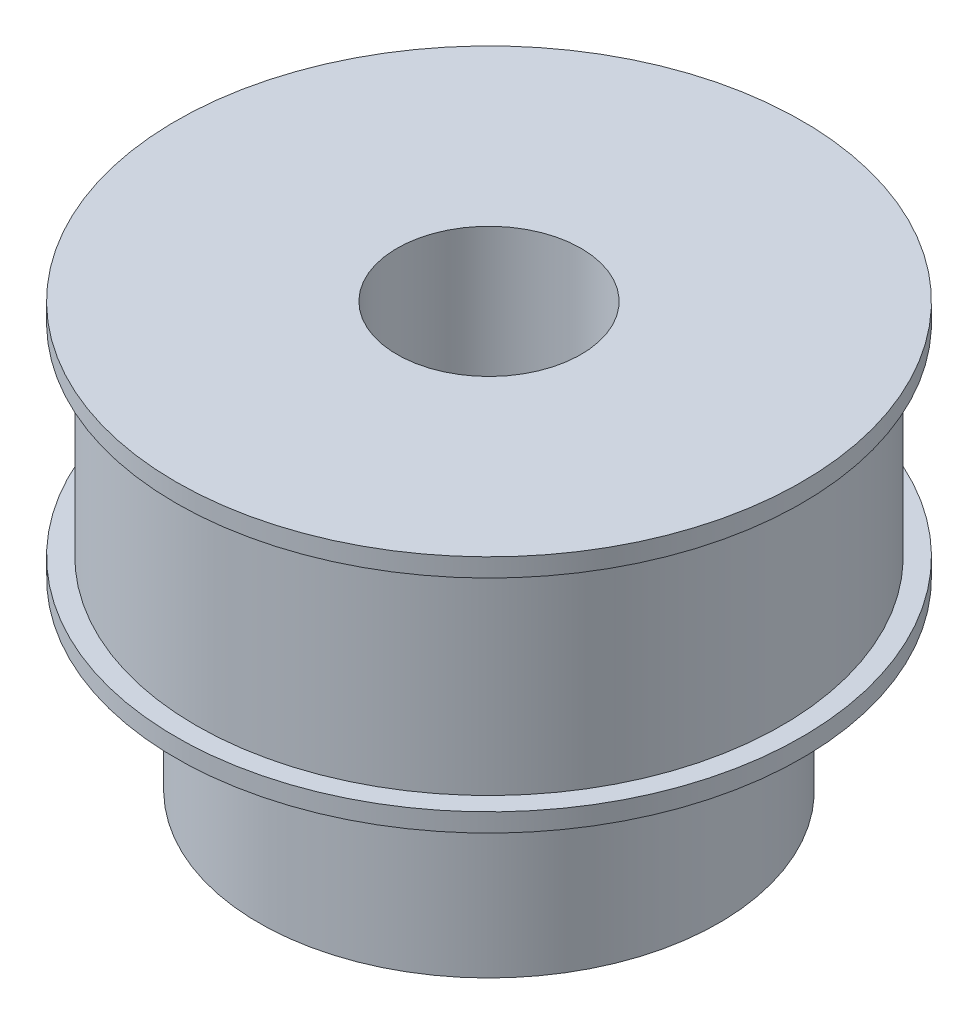
ISO-10303-21;
HEADER;
FILE_DESCRIPTION(('STEP AP214'),'2;1');
FILE_NAME('part.step','',(''),(''),'','','');
FILE_SCHEMA(('AUTOMOTIVE_DESIGN { 1 0 10303 214 1 1 1 1 }'));
ENDSEC;
DATA;
#1=APPLICATION_CONTEXT('core data for automotive mechanical design processes');
#2=APPLICATION_PROTOCOL_DEFINITION('international standard','automotive_design',2000,#1);
#3=PRODUCT_CONTEXT('',#1,'mechanical');
#4=PRODUCT('Part','Part','',(#3));
#5=PRODUCT_RELATED_PRODUCT_CATEGORY('part','',(#4));
#6=PRODUCT_DEFINITION_FORMATION('','',#4);
#7=PRODUCT_DEFINITION_CONTEXT('part definition',#1,'design');
#8=PRODUCT_DEFINITION('design','',#6,#7);
#9=PRODUCT_DEFINITION_SHAPE('','',#8);
#10=(LENGTH_UNIT() NAMED_UNIT(*) SI_UNIT(.MILLI.,.METRE.));
#11=(NAMED_UNIT(*) PLANE_ANGLE_UNIT() SI_UNIT($,.RADIAN.));
#12=(NAMED_UNIT(*) SI_UNIT($,.STERADIAN.) SOLID_ANGLE_UNIT());
#13=UNCERTAINTY_MEASURE_WITH_UNIT(LENGTH_MEASURE(1.E-05),#10,'distance_accuracy_value','');
#14=(GEOMETRIC_REPRESENTATION_CONTEXT(3) GLOBAL_UNCERTAINTY_ASSIGNED_CONTEXT((#13)) GLOBAL_UNIT_ASSIGNED_CONTEXT((#10,
#11,#12)) REPRESENTATION_CONTEXT('',''));
#15=CARTESIAN_POINT('',(0.,0.,0.));
#16=DIRECTION('',(0.,0.,1.));
#17=DIRECTION('',(1.,0.,0.));
#18=AXIS2_PLACEMENT_3D('',#15,#16,#17);
#19=CARTESIAN_POINT('',(0.,11.,0.));
#20=DIRECTION('',(0.,-1.,0.));
#21=DIRECTION('',(0.,0.,-1.));
#22=AXIS2_PLACEMENT_3D('',#19,#20,#21);
#23=CYLINDRICAL_SURFACE('',#22,15.915);
#24=CARTESIAN_POINT('',(0.,11.,0.));
#25=DIRECTION('',(0.,1.,0.));
#26=DIRECTION('',(0.,0.,1.));
#27=AXIS2_PLACEMENT_3D('',#24,#25,#26);
#28=CIRCLE('',#27,15.915);
#29=CARTESIAN_POINT('',(0.,11.,15.915));
#30=VERTEX_POINT('',#29);
#31=EDGE_CURVE('E39',#30,#30,#28,.T.);
#32=ORIENTED_EDGE('',*,*,#31,.F.);
#33=EDGE_LOOP('',(#32));
#34=FACE_BOUND('',#33,.T.);
#35=CARTESIAN_POINT('',(0.,0.,0.));
#36=DIRECTION('',(0.,1.,0.));
#37=DIRECTION('',(0.,0.,1.));
#38=AXIS2_PLACEMENT_3D('',#35,#36,#37);
#39=CIRCLE('',#38,15.915);
#40=CARTESIAN_POINT('',(0.,0.,15.915));
#41=VERTEX_POINT('',#40);
#42=EDGE_CURVE('E35',#41,#41,#39,.T.);
#43=ORIENTED_EDGE('',*,*,#42,.T.);
#44=EDGE_LOOP('',(#43));
#45=FACE_BOUND('',#44,.T.);
#46=ADVANCED_FACE('F32',(#34,#45),#23,.T.);
#47=CARTESIAN_POINT('',(0.,12.,0.));
#48=DIRECTION('',(0.,-1.,0.));
#49=DIRECTION('',(0.,0.,-1.));
#50=AXIS2_PLACEMENT_3D('',#47,#48,#49);
#51=CYLINDRICAL_SURFACE('',#50,17.);
#52=CARTESIAN_POINT('',(0.,12.,0.));
#53=DIRECTION('',(0.,1.,0.));
#54=DIRECTION('',(0.,0.,1.));
#55=AXIS2_PLACEMENT_3D('',#52,#53,#54);
#56=CIRCLE('',#55,17.);
#57=CARTESIAN_POINT('',(0.,12.,17.));
#58=VERTEX_POINT('',#57);
#59=EDGE_CURVE('E44',#58,#58,#56,.T.);
#60=ORIENTED_EDGE('',*,*,#59,.F.);
#61=EDGE_LOOP('',(#60));
#62=FACE_BOUND('',#61,.T.);
#63=CARTESIAN_POINT('',(0.,11.,0.));
#64=DIRECTION('',(0.,1.,0.));
#65=DIRECTION('',(0.,0.,1.));
#66=AXIS2_PLACEMENT_3D('',#63,#64,#65);
#67=CIRCLE('',#66,17.);
#68=CARTESIAN_POINT('',(0.,11.,17.));
#69=VERTEX_POINT('',#68);
#70=EDGE_CURVE('E60',#69,#69,#67,.T.);
#71=ORIENTED_EDGE('',*,*,#70,.T.);
#72=EDGE_LOOP('',(#71));
#73=FACE_BOUND('',#72,.T.);
#74=ADVANCED_FACE('F93',(#62,#73),#51,.T.);
#75=CARTESIAN_POINT('',(0.,12.,0.));
#76=DIRECTION('',(0.,1.,0.));
#77=DIRECTION('',(0.,0.,1.));
#78=AXIS2_PLACEMENT_3D('',#75,#76,#77);
#79=PLANE('',#78);
#80=CARTESIAN_POINT('',(0.,12.,0.));
#81=DIRECTION('',(0.,-1.,0.));
#82=DIRECTION('',(0.,0.,-1.));
#83=AXIS2_PLACEMENT_3D('',#80,#81,#82);
#84=CIRCLE('',#83,5.);
#85=CARTESIAN_POINT('',(0.,12.,-5.));
#86=VERTEX_POINT('',#85);
#87=EDGE_CURVE('E49',#86,#86,#84,.T.);
#88=ORIENTED_EDGE('',*,*,#87,.T.);
#89=EDGE_LOOP('',(#88));
#90=FACE_BOUND('',#89,.T.);
#91=ORIENTED_EDGE('',*,*,#59,.T.);
#92=EDGE_LOOP('',(#91));
#93=FACE_BOUND('',#92,.T.);
#94=ADVANCED_FACE('F87',(#90,#93),#79,.T.);
#95=CARTESIAN_POINT('',(0.,11.,0.));
#96=DIRECTION('',(0.,1.,0.));
#97=DIRECTION('',(0.,0.,1.));
#98=AXIS2_PLACEMENT_3D('',#95,#96,#97);
#99=PLANE('',#98);
#100=ORIENTED_EDGE('',*,*,#31,.T.);
#101=EDGE_LOOP('',(#100));
#102=FACE_BOUND('',#101,.T.);
#103=ORIENTED_EDGE('',*,*,#70,.F.);
#104=EDGE_LOOP('',(#103));
#105=FACE_BOUND('',#104,.T.);
#106=ADVANCED_FACE('F78',(#102,#105),#99,.F.);
#107=CARTESIAN_POINT('',(0.,-1.,0.));
#108=DIRECTION('',(0.,1.,0.));
#109=DIRECTION('',(0.,0.,1.));
#110=AXIS2_PLACEMENT_3D('',#107,#108,#109);
#111=CYLINDRICAL_SURFACE('',#110,17.);
#112=CARTESIAN_POINT('',(0.,-1.,0.));
#113=DIRECTION('',(0.,-1.,0.));
#114=DIRECTION('',(0.,0.,-1.));
#115=AXIS2_PLACEMENT_3D('',#112,#113,#114);
#116=CIRCLE('',#115,17.);
#117=CARTESIAN_POINT('',(0.,-1.,-17.));
#118=VERTEX_POINT('',#117);
#119=EDGE_CURVE('E53',#118,#118,#116,.T.);
#120=ORIENTED_EDGE('',*,*,#119,.F.);
#121=EDGE_LOOP('',(#120));
#122=FACE_BOUND('',#121,.T.);
#123=CARTESIAN_POINT('',(0.,0.,0.));
#124=DIRECTION('',(0.,-1.,0.));
#125=DIRECTION('',(0.,0.,-1.));
#126=AXIS2_PLACEMENT_3D('',#123,#124,#125);
#127=CIRCLE('',#126,17.);
#128=CARTESIAN_POINT('',(0.,0.,-17.));
#129=VERTEX_POINT('',#128);
#130=EDGE_CURVE('E52',#129,#129,#127,.T.);
#131=ORIENTED_EDGE('',*,*,#130,.T.);
#132=EDGE_LOOP('',(#131));
#133=FACE_BOUND('',#132,.T.);
#134=ADVANCED_FACE('F76',(#122,#133),#111,.T.);
#135=CARTESIAN_POINT('',(0.,-1.,0.));
#136=DIRECTION('',(0.,-1.,0.));
#137=DIRECTION('',(0.,0.,-1.));
#138=AXIS2_PLACEMENT_3D('',#135,#136,#137);
#139=PLANE('',#138);
#140=CARTESIAN_POINT('',(0.,-1.,0.));
#141=DIRECTION('',(0.,-1.,0.));
#142=DIRECTION('',(0.,0.,-1.));
#143=AXIS2_PLACEMENT_3D('',#140,#141,#142);
#144=CIRCLE('',#143,12.5);
#145=CARTESIAN_POINT('',(0.,-1.,-12.5));
#146=VERTEX_POINT('',#145);
#147=EDGE_CURVE('E10',#146,#146,#144,.T.);
#148=ORIENTED_EDGE('',*,*,#147,.F.);
#149=EDGE_LOOP('',(#148));
#150=FACE_BOUND('',#149,.T.);
#151=ORIENTED_EDGE('',*,*,#119,.T.);
#152=EDGE_LOOP('',(#151));
#153=FACE_BOUND('',#152,.T.);
#154=ADVANCED_FACE('F72',(#150,#153),#139,.T.);
#155=CARTESIAN_POINT('',(0.,0.,0.));
#156=DIRECTION('',(0.,-1.,0.));
#157=DIRECTION('',(0.,0.,-1.));
#158=AXIS2_PLACEMENT_3D('',#155,#156,#157);
#159=PLANE('',#158);
#160=ORIENTED_EDGE('',*,*,#42,.F.);
#161=EDGE_LOOP('',(#160));
#162=FACE_BOUND('',#161,.T.);
#163=ORIENTED_EDGE('',*,*,#130,.F.);
#164=EDGE_LOOP('',(#163));
#165=FACE_BOUND('',#164,.T.);
#166=ADVANCED_FACE('F68',(#162,#165),#159,.F.);
#167=CARTESIAN_POINT('',(0.,12.,0.));
#168=DIRECTION('',(0.,-1.,0.));
#169=DIRECTION('',(0.,0.,-1.));
#170=AXIS2_PLACEMENT_3D('',#167,#168,#169);
#171=CYLINDRICAL_SURFACE('',#170,5.);
#172=ORIENTED_EDGE('',*,*,#87,.F.);
#173=EDGE_LOOP('',(#172));
#174=FACE_BOUND('',#173,.T.);
#175=CARTESIAN_POINT('',(0.,-11.,0.));
#176=DIRECTION('',(0.,-1.,0.));
#177=DIRECTION('',(0.,0.,-1.));
#178=AXIS2_PLACEMENT_3D('',#175,#176,#177);
#179=CIRCLE('',#178,5.);
#180=CARTESIAN_POINT('',(0.,-11.,-5.));
#181=VERTEX_POINT('',#180);
#182=EDGE_CURVE('E117',#181,#181,#179,.T.);
#183=ORIENTED_EDGE('',*,*,#182,.T.);
#184=EDGE_LOOP('',(#183));
#185=FACE_BOUND('',#184,.T.);
#186=ADVANCED_FACE('F71',(#174,#185),#171,.F.);
#187=CARTESIAN_POINT('',(0.,-11.,0.));
#188=DIRECTION('',(0.,-1.,0.));
#189=DIRECTION('',(0.,0.,-1.));
#190=AXIS2_PLACEMENT_3D('',#187,#188,#189);
#191=PLANE('',#190);
#192=CARTESIAN_POINT('',(0.,-11.,0.));
#193=DIRECTION('',(0.,-1.,0.));
#194=DIRECTION('',(0.,0.,-1.));
#195=AXIS2_PLACEMENT_3D('',#192,#193,#194);
#196=CIRCLE('',#195,12.5);
#197=CARTESIAN_POINT('',(0.,-11.,-12.5));
#198=VERTEX_POINT('',#197);
#199=EDGE_CURVE('E47',#198,#198,#196,.T.);
#200=ORIENTED_EDGE('',*,*,#199,.T.);
#201=EDGE_LOOP('',(#200));
#202=FACE_BOUND('',#201,.T.);
#203=ORIENTED_EDGE('',*,*,#182,.F.);
#204=EDGE_LOOP('',(#203));
#205=FACE_BOUND('',#204,.T.);
#206=ADVANCED_FACE('F113',(#202,#205),#191,.T.);
#207=CARTESIAN_POINT('',(0.,-11.,0.));
#208=DIRECTION('',(0.,1.,0.));
#209=DIRECTION('',(0.,0.,1.));
#210=AXIS2_PLACEMENT_3D('',#207,#208,#209);
#211=CYLINDRICAL_SURFACE('',#210,12.5);
#212=ORIENTED_EDGE('',*,*,#199,.F.);
#213=EDGE_LOOP('',(#212));
#214=FACE_BOUND('',#213,.T.);
#215=ORIENTED_EDGE('',*,*,#147,.T.);
#216=EDGE_LOOP('',(#215));
#217=FACE_BOUND('',#216,.T.);
#218=ADVANCED_FACE('F123',(#214,#217),#211,.T.);
#219=CLOSED_SHELL('',(#46,#74,#94,#106,#134,#154,#166,#186,#206,#218));
#220=MANIFOLD_SOLID_BREP('B2',#219);
#221=ADVANCED_BREP_SHAPE_REPRESENTATION('',(#18,#220),#14);
#222=SHAPE_DEFINITION_REPRESENTATION(#9,#221);
ENDSEC;
END-ISO-10303-21;
